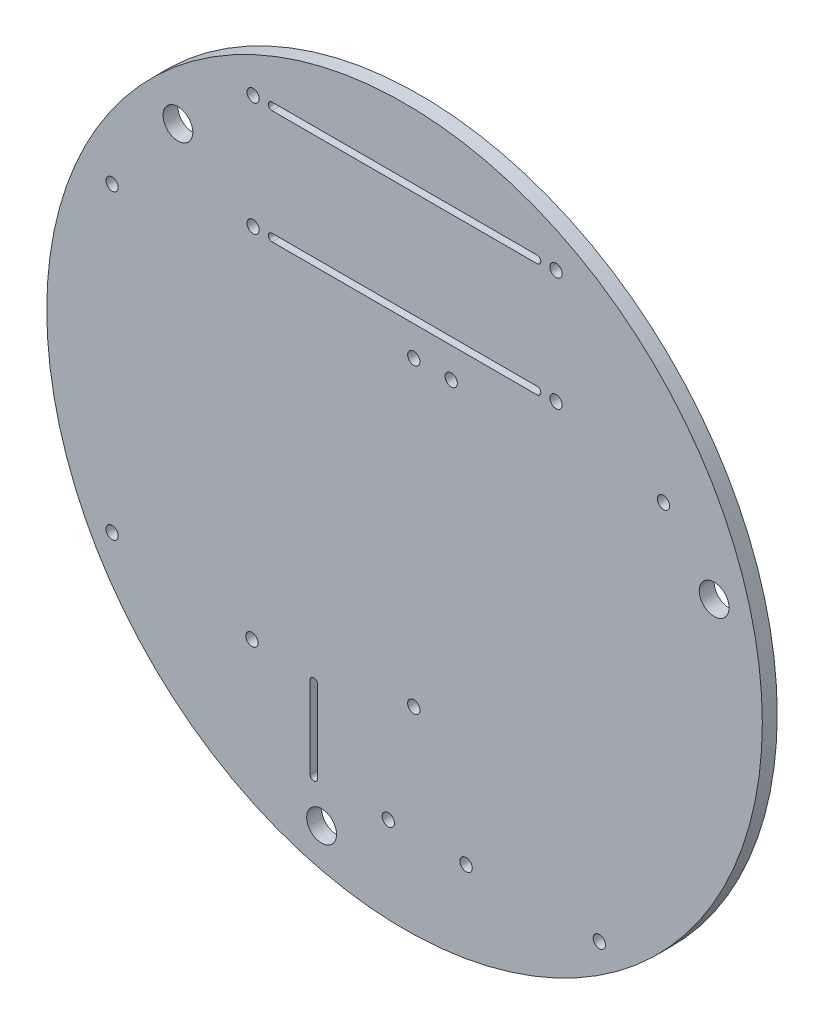
ISO-10303-21;
HEADER;
FILE_DESCRIPTION(('STEP AP214'),'2;1');
FILE_NAME('part.step','',(''),(''),'','','');
FILE_SCHEMA(('AUTOMOTIVE_DESIGN { 1 0 10303 214 1 1 1 1 }'));
ENDSEC;
DATA;
#1=APPLICATION_CONTEXT('core data for automotive mechanical design processes');
#2=APPLICATION_PROTOCOL_DEFINITION('international standard','automotive_design',2000,#1);
#3=PRODUCT_CONTEXT('',#1,'mechanical');
#4=PRODUCT('Part','Part','',(#3));
#5=PRODUCT_RELATED_PRODUCT_CATEGORY('part','',(#4));
#6=PRODUCT_DEFINITION_FORMATION('','',#4);
#7=PRODUCT_DEFINITION_CONTEXT('part definition',#1,'design');
#8=PRODUCT_DEFINITION('design','',#6,#7);
#9=PRODUCT_DEFINITION_SHAPE('','',#8);
#10=(LENGTH_UNIT() NAMED_UNIT(*) SI_UNIT(.MILLI.,.METRE.));
#11=(NAMED_UNIT(*) PLANE_ANGLE_UNIT() SI_UNIT($,.RADIAN.));
#12=(NAMED_UNIT(*) SI_UNIT($,.STERADIAN.) SOLID_ANGLE_UNIT());
#13=UNCERTAINTY_MEASURE_WITH_UNIT(LENGTH_MEASURE(1.E-05),#10,'distance_accuracy_value','');
#14=(GEOMETRIC_REPRESENTATION_CONTEXT(3) GLOBAL_UNCERTAINTY_ASSIGNED_CONTEXT((#13)) GLOBAL_UNIT_ASSIGNED_CONTEXT((#10,
#11,#12)) REPRESENTATION_CONTEXT('',''));
#15=CARTESIAN_POINT('',(0.,0.,0.));
#16=DIRECTION('',(0.,0.,1.));
#17=DIRECTION('',(1.,0.,0.));
#18=AXIS2_PLACEMENT_3D('',#15,#16,#17);
#19=CARTESIAN_POINT('',(0.,0.,2.));
#20=DIRECTION('',(0.,0.,-1.));
#21=DIRECTION('',(-1.,0.,0.));
#22=AXIS2_PLACEMENT_3D('',#19,#20,#21);
#23=CYLINDRICAL_SURFACE('',#22,48.);
#24=CARTESIAN_POINT('',(0.,0.,2.));
#25=DIRECTION('',(0.,0.,1.));
#26=DIRECTION('',(1.,0.,0.));
#27=AXIS2_PLACEMENT_3D('',#24,#25,#26);
#28=CIRCLE('',#27,48.);
#29=CARTESIAN_POINT('',(48.,0.,2.));
#30=VERTEX_POINT('',#29);
#31=EDGE_CURVE('E11',#30,#30,#28,.T.);
#32=ORIENTED_EDGE('',*,*,#31,.F.);
#33=EDGE_LOOP('',(#32));
#34=FACE_BOUND('',#33,.T.);
#35=CARTESIAN_POINT('',(0.,0.,0.));
#36=DIRECTION('',(0.,0.,1.));
#37=DIRECTION('',(1.,0.,0.));
#38=AXIS2_PLACEMENT_3D('',#35,#36,#37);
#39=CIRCLE('',#38,48.);
#40=CARTESIAN_POINT('',(48.,0.,0.));
#41=VERTEX_POINT('',#40);
#42=EDGE_CURVE('E38',#41,#41,#39,.T.);
#43=ORIENTED_EDGE('',*,*,#42,.T.);
#44=EDGE_LOOP('',(#43));
#45=FACE_BOUND('',#44,.T.);
#46=ADVANCED_FACE('F35',(#34,#45),#23,.T.);
#47=CARTESIAN_POINT('',(0.,0.,2.));
#48=DIRECTION('',(0.,0.,1.));
#49=DIRECTION('',(1.,0.,0.));
#50=AXIS2_PLACEMENT_3D('',#47,#48,#49);
#51=PLANE('',#50);
#52=CARTESIAN_POINT('',(-20.48,-24.54,2.));
#53=DIRECTION('',(0.,0.,-1.));
#54=DIRECTION('',(-1.,0.,0.));
#55=AXIS2_PLACEMENT_3D('',#52,#53,#54);
#56=CIRCLE('',#55,0.825000000000001);
#57=CARTESIAN_POINT('',(-21.305,-24.54,2.));
#58=VERTEX_POINT('',#57);
#59=EDGE_CURVE('E154',#58,#58,#56,.T.);
#60=ORIENTED_EDGE('',*,*,#59,.T.);
#61=EDGE_LOOP('',(#60));
#62=FACE_BOUND('',#61,.T.);
#63=CARTESIAN_POINT('',(-12.18,-36.34,2.));
#64=DIRECTION('',(0.,0.,-1.));
#65=DIRECTION('',(-1.,0.,0.));
#66=AXIS2_PLACEMENT_3D('',#63,#64,#65);
#67=CIRCLE('',#66,0.5);
#68=CARTESIAN_POINT('',(-11.68,-36.34,2.));
#69=VERTEX_POINT('',#68);
#70=CARTESIAN_POINT('',(-12.68,-36.34,2.));
#71=VERTEX_POINT('',#70);
#72=EDGE_CURVE('E125',#69,#71,#67,.T.);
#73=ORIENTED_EDGE('',*,*,#72,.T.);
#74=DIRECTION('',(0.,1.,0.));
#75=VECTOR('',#74,1.);
#76=CARTESIAN_POINT('',(-12.68,-36.34,2.));
#77=LINE('',#76,#75);
#78=CARTESIAN_POINT('',(-12.68,-25.34,2.));
#79=VERTEX_POINT('',#78);
#80=EDGE_CURVE('E134',#71,#79,#77,.T.);
#81=ORIENTED_EDGE('',*,*,#80,.T.);
#82=CARTESIAN_POINT('',(-12.18,-25.34,2.));
#83=DIRECTION('',(0.,0.,-1.));
#84=DIRECTION('',(-1.,0.,0.));
#85=AXIS2_PLACEMENT_3D('',#82,#83,#84);
#86=CIRCLE('',#85,0.5);
#87=CARTESIAN_POINT('',(-11.68,-25.34,2.));
#88=VERTEX_POINT('',#87);
#89=EDGE_CURVE('E49',#79,#88,#86,.T.);
#90=ORIENTED_EDGE('',*,*,#89,.T.);
#91=DIRECTION('',(0.,-1.,0.));
#92=VECTOR('',#91,1.);
#93=CARTESIAN_POINT('',(-11.68,-36.34,2.));
#94=LINE('',#93,#92);
#95=EDGE_CURVE('E131',#88,#69,#94,.T.);
#96=ORIENTED_EDGE('',*,*,#95,.T.);
#97=EDGE_LOOP('',(#73,#81,#90,#96));
#98=FACE_BOUND('',#97,.T.);
#99=CARTESIAN_POINT('',(26.13,-36.34,2.));
#100=DIRECTION('',(0.,0.,-1.));
#101=DIRECTION('',(1.,0.,0.));
#102=AXIS2_PLACEMENT_3D('',#99,#100,#101);
#103=CIRCLE('',#102,0.824999999999998);
#104=CARTESIAN_POINT('',(26.955,-36.34,2.));
#105=VERTEX_POINT('',#104);
#106=EDGE_CURVE('E459',#105,#105,#103,.T.);
#107=ORIENTED_EDGE('',*,*,#106,.T.);
#108=EDGE_LOOP('',(#107));
#109=FACE_BOUND('',#108,.T.);
#110=CARTESIAN_POINT('',(-2.18,-36.34,2.));
#111=DIRECTION('',(0.,0.,-1.));
#112=DIRECTION('',(-1.,0.,0.));
#113=AXIS2_PLACEMENT_3D('',#110,#111,#112);
#114=CIRCLE('',#113,0.825);
#115=CARTESIAN_POINT('',(-3.005,-36.34,2.));
#116=VERTEX_POINT('',#115);
#117=EDGE_CURVE('E175',#116,#116,#114,.T.);
#118=ORIENTED_EDGE('',*,*,#117,.T.);
#119=EDGE_LOOP('',(#118));
#120=FACE_BOUND('',#119,.T.);
#121=CARTESIAN_POINT('',(8.26,-36.34,2.));
#122=DIRECTION('',(0.,0.,-1.));
#123=DIRECTION('',(-1.,0.,0.));
#124=AXIS2_PLACEMENT_3D('',#121,#122,#123);
#125=CIRCLE('',#124,0.825);
#126=CARTESIAN_POINT('',(7.435,-36.34,2.));
#127=VERTEX_POINT('',#126);
#128=EDGE_CURVE('E168',#127,#127,#125,.T.);
#129=ORIENTED_EDGE('',*,*,#128,.T.);
#130=EDGE_LOOP('',(#129));
#131=FACE_BOUND('',#130,.T.);
#132=CARTESIAN_POINT('',(6.25999999999999,18.98,2.));
#133=DIRECTION('',(0.,0.,1.));
#134=DIRECTION('',(-1.,0.,0.));
#135=AXIS2_PLACEMENT_3D('',#132,#133,#134);
#136=CIRCLE('',#135,0.825000000000001);
#137=CARTESIAN_POINT('',(5.43499999999999,18.98,2.));
#138=VERTEX_POINT('',#137);
#139=EDGE_CURVE('E262',#138,#138,#136,.T.);
#140=ORIENTED_EDGE('',*,*,#139,.F.);
#141=EDGE_LOOP('',(#140));
#142=FACE_BOUND('',#141,.T.);
#143=CARTESIAN_POINT('',(-39.24,18.98,2.));
#144=DIRECTION('',(0.,0.,1.));
#145=DIRECTION('',(1.,0.,0.));
#146=AXIS2_PLACEMENT_3D('',#143,#144,#145);
#147=CIRCLE('',#146,0.825000000000001);
#148=CARTESIAN_POINT('',(-38.415,18.98,2.));
#149=VERTEX_POINT('',#148);
#150=EDGE_CURVE('E249',#149,#149,#147,.T.);
#151=ORIENTED_EDGE('',*,*,#150,.F.);
#152=EDGE_LOOP('',(#151));
#153=FACE_BOUND('',#152,.T.);
#154=CARTESIAN_POINT('',(1.24000000000001,18.98,2.));
#155=DIRECTION('',(0.,0.,1.));
#156=DIRECTION('',(-1.,0.,0.));
#157=AXIS2_PLACEMENT_3D('',#154,#155,#156);
#158=CIRCLE('',#157,0.825000000000001);
#159=CARTESIAN_POINT('',(0.415000000000004,18.98,2.));
#160=VERTEX_POINT('',#159);
#161=EDGE_CURVE('E250',#160,#160,#158,.T.);
#162=ORIENTED_EDGE('',*,*,#161,.F.);
#163=EDGE_LOOP('',(#162));
#164=FACE_BOUND('',#163,.T.);
#165=CARTESIAN_POINT('',(1.24000000000001,-21.5,2.));
#166=DIRECTION('',(0.,0.,1.));
#167=DIRECTION('',(1.,0.,0.));
#168=AXIS2_PLACEMENT_3D('',#165,#166,#167);
#169=CIRCLE('',#168,0.825000000000001);
#170=CARTESIAN_POINT('',(2.06500000000001,-21.5,2.));
#171=VERTEX_POINT('',#170);
#172=EDGE_CURVE('E179',#171,#171,#169,.T.);
#173=ORIENTED_EDGE('',*,*,#172,.F.);
#174=EDGE_LOOP('',(#173));
#175=FACE_BOUND('',#174,.T.);
#176=CARTESIAN_POINT('',(20.32,23.5,2.));
#177=DIRECTION('',(0.,0.,1.));
#178=DIRECTION('',(-1.,0.,0.));
#179=AXIS2_PLACEMENT_3D('',#176,#177,#178);
#180=CIRCLE('',#179,0.825000000000001);
#181=CARTESIAN_POINT('',(19.495,23.5,2.));
#182=VERTEX_POINT('',#181);
#183=EDGE_CURVE('E286',#182,#182,#180,.T.);
#184=ORIENTED_EDGE('',*,*,#183,.F.);
#185=EDGE_LOOP('',(#184));
#186=FACE_BOUND('',#185,.T.);
#187=CARTESIAN_POINT('',(-20.32,23.5,2.));
#188=DIRECTION('',(0.,0.,1.));
#189=DIRECTION('',(1.,0.,0.));
#190=AXIS2_PLACEMENT_3D('',#187,#188,#189);
#191=CIRCLE('',#190,0.825000000000001);
#192=CARTESIAN_POINT('',(-19.495,23.5,2.));
#193=VERTEX_POINT('',#192);
#194=EDGE_CURVE('E273',#193,#193,#191,.T.);
#195=ORIENTED_EDGE('',*,*,#194,.F.);
#196=EDGE_LOOP('',(#195));
#197=FACE_BOUND('',#196,.T.);
#198=CARTESIAN_POINT('',(-20.32,38.74,2.));
#199=DIRECTION('',(0.,0.,1.));
#200=DIRECTION('',(-1.,0.,0.));
#201=AXIS2_PLACEMENT_3D('',#198,#199,#200);
#202=CIRCLE('',#201,0.825000000000001);
#203=CARTESIAN_POINT('',(-21.145,38.74,2.));
#204=VERTEX_POINT('',#203);
#205=EDGE_CURVE('E274',#204,#204,#202,.T.);
#206=ORIENTED_EDGE('',*,*,#205,.F.);
#207=EDGE_LOOP('',(#206));
#208=FACE_BOUND('',#207,.T.);
#209=CARTESIAN_POINT('',(34.74,18.98,2.));
#210=DIRECTION('',(0.,0.,1.));
#211=DIRECTION('',(1.,0.,0.));
#212=AXIS2_PLACEMENT_3D('',#209,#210,#211);
#213=CIRCLE('',#212,0.825000000000001);
#214=CARTESIAN_POINT('',(35.565,18.98,2.));
#215=VERTEX_POINT('',#214);
#216=EDGE_CURVE('E261',#215,#215,#213,.T.);
#217=ORIENTED_EDGE('',*,*,#216,.F.);
#218=EDGE_LOOP('',(#217));
#219=FACE_BOUND('',#218,.T.);
#220=CARTESIAN_POINT('',(-39.24,-21.5,2.));
#221=DIRECTION('',(0.,0.,1.));
#222=DIRECTION('',(-1.,0.,0.));
#223=AXIS2_PLACEMENT_3D('',#220,#221,#222);
#224=CIRCLE('',#223,0.825000000000001);
#225=CARTESIAN_POINT('',(-40.065,-21.5,2.));
#226=VERTEX_POINT('',#225);
#227=EDGE_CURVE('E180',#226,#226,#224,.T.);
#228=ORIENTED_EDGE('',*,*,#227,.F.);
#229=EDGE_LOOP('',(#228));
#230=FACE_BOUND('',#229,.T.);
#231=CARTESIAN_POINT('',(17.78,23.5,2.));
#232=DIRECTION('',(0.,0.,1.));
#233=DIRECTION('',(1.,0.,0.));
#234=AXIS2_PLACEMENT_3D('',#231,#232,#233);
#235=CIRCLE('',#234,0.499999999999997);
#236=CARTESIAN_POINT('',(17.78,23.,2.));
#237=VERTEX_POINT('',#236);
#238=CARTESIAN_POINT('',(17.78,24.,2.));
#239=VERTEX_POINT('',#238);
#240=EDGE_CURVE('E198',#237,#239,#235,.T.);
#241=ORIENTED_EDGE('',*,*,#240,.F.);
#242=DIRECTION('',(1.,0.,0.));
#243=VECTOR('',#242,1.);
#244=CARTESIAN_POINT('',(17.78,23.,2.));
#245=LINE('',#244,#243);
#246=CARTESIAN_POINT('',(-17.78,23.,2.));
#247=VERTEX_POINT('',#246);
#248=EDGE_CURVE('E188',#247,#237,#245,.T.);
#249=ORIENTED_EDGE('',*,*,#248,.F.);
#250=CARTESIAN_POINT('',(-17.78,23.5,2.));
#251=DIRECTION('',(0.,0.,1.));
#252=DIRECTION('',(1.,0.,0.));
#253=AXIS2_PLACEMENT_3D('',#250,#251,#252);
#254=CIRCLE('',#253,0.500000000000002);
#255=CARTESIAN_POINT('',(-17.78,24.,2.));
#256=VERTEX_POINT('',#255);
#257=EDGE_CURVE('E204',#256,#247,#254,.T.);
#258=ORIENTED_EDGE('',*,*,#257,.F.);
#259=DIRECTION('',(-1.,0.,0.));
#260=VECTOR('',#259,1.);
#261=CARTESIAN_POINT('',(17.78,24.,2.));
#262=LINE('',#261,#260);
#263=EDGE_CURVE('E200',#239,#256,#262,.T.);
#264=ORIENTED_EDGE('',*,*,#263,.F.);
#265=EDGE_LOOP('',(#241,#249,#258,#264));
#266=FACE_BOUND('',#265,.T.);
#267=CARTESIAN_POINT('',(17.78,38.74,2.));
#268=DIRECTION('',(0.,0.,1.));
#269=DIRECTION('',(-1.,0.,0.));
#270=AXIS2_PLACEMENT_3D('',#267,#268,#269);
#271=CIRCLE('',#270,0.5);
#272=CARTESIAN_POINT('',(17.78,38.24,2.));
#273=VERTEX_POINT('',#272);
#274=CARTESIAN_POINT('',(17.78,39.24,2.));
#275=VERTEX_POINT('',#274);
#276=EDGE_CURVE('E171',#273,#275,#271,.T.);
#277=ORIENTED_EDGE('',*,*,#276,.F.);
#278=DIRECTION('',(1.,0.,0.));
#279=VECTOR('',#278,1.);
#280=CARTESIAN_POINT('',(17.78,38.24,2.));
#281=LINE('',#280,#279);
#282=CARTESIAN_POINT('',(-17.78,38.24,2.));
#283=VERTEX_POINT('',#282);
#284=EDGE_CURVE('E220',#283,#273,#281,.T.);
#285=ORIENTED_EDGE('',*,*,#284,.F.);
#286=CARTESIAN_POINT('',(-17.78,38.74,2.));
#287=DIRECTION('',(0.,0.,1.));
#288=DIRECTION('',(-1.,0.,0.));
#289=AXIS2_PLACEMENT_3D('',#286,#287,#288);
#290=CIRCLE('',#289,0.5);
#291=CARTESIAN_POINT('',(-17.78,39.24,2.));
#292=VERTEX_POINT('',#291);
#293=EDGE_CURVE('E234',#292,#283,#290,.T.);
#294=ORIENTED_EDGE('',*,*,#293,.F.);
#295=DIRECTION('',(-1.,0.,0.));
#296=VECTOR('',#295,1.);
#297=CARTESIAN_POINT('',(17.78,39.24,2.));
#298=LINE('',#297,#296);
#299=EDGE_CURVE('E231',#275,#292,#298,.T.);
#300=ORIENTED_EDGE('',*,*,#299,.F.);
#301=EDGE_LOOP('',(#277,#285,#294,#300));
#302=FACE_BOUND('',#301,.T.);
#303=CARTESIAN_POINT('',(20.32,38.74,2.));
#304=DIRECTION('',(0.,0.,1.));
#305=DIRECTION('',(1.,0.,0.));
#306=AXIS2_PLACEMENT_3D('',#303,#304,#305);
#307=CIRCLE('',#306,0.825000000000001);
#308=CARTESIAN_POINT('',(21.145,38.74,2.));
#309=VERTEX_POINT('',#308);
#310=EDGE_CURVE('E285',#309,#309,#307,.T.);
#311=ORIENTED_EDGE('',*,*,#310,.F.);
#312=EDGE_LOOP('',(#311));
#313=FACE_BOUND('',#312,.T.);
#314=CARTESIAN_POINT('',(41.5348105304283,11.1292189394104,2.));
#315=DIRECTION('',(0.,0.,-1.));
#316=DIRECTION('',(-1.,0.,0.));
#317=AXIS2_PLACEMENT_3D('',#314,#315,#316);
#318=CIRCLE('',#317,2.);
#319=CARTESIAN_POINT('',(39.5348105304283,11.1292189394104,2.));
#320=VERTEX_POINT('',#319);
#321=EDGE_CURVE('E300',#320,#320,#318,.T.);
#322=ORIENTED_EDGE('',*,*,#321,.T.);
#323=EDGE_LOOP('',(#322));
#324=FACE_BOUND('',#323,.T.);
#325=CARTESIAN_POINT('',(-30.4055915910216,30.4055915910215,2.));
#326=DIRECTION('',(0.,0.,-1.));
#327=DIRECTION('',(-1.,0.,0.));
#328=AXIS2_PLACEMENT_3D('',#325,#326,#327);
#329=CIRCLE('',#328,2.00000000000001);
#330=CARTESIAN_POINT('',(-32.4055915910216,30.4055915910215,2.));
#331=VERTEX_POINT('',#330);
#332=EDGE_CURVE('E309',#331,#331,#329,.T.);
#333=ORIENTED_EDGE('',*,*,#332,.T.);
#334=EDGE_LOOP('',(#333));
#335=FACE_BOUND('',#334,.T.);
#336=CARTESIAN_POINT('',(-11.1292189394084,-41.534810530431,2.));
#337=DIRECTION('',(0.,0.,-1.));
#338=DIRECTION('',(-1.,0.,0.));
#339=AXIS2_PLACEMENT_3D('',#336,#337,#338);
#340=CIRCLE('',#339,2.);
#341=CARTESIAN_POINT('',(-13.1292189394084,-41.534810530431,2.));
#342=VERTEX_POINT('',#341);
#343=EDGE_CURVE('E297',#342,#342,#340,.T.);
#344=ORIENTED_EDGE('',*,*,#343,.T.);
#345=EDGE_LOOP('',(#344));
#346=FACE_BOUND('',#345,.T.);
#347=ORIENTED_EDGE('',*,*,#31,.T.);
#348=EDGE_LOOP('',(#347));
#349=FACE_BOUND('',#348,.T.);
#350=ADVANCED_FACE('F138',(#62,#98,#109,#120,#131,#142,#153,#164,#175,#186,#197,#208,#219,#230,
#266,#302,#313,#324,#335,#346,#349),#51,.T.);
#351=CARTESIAN_POINT('',(0.,0.,0.));
#352=DIRECTION('',(0.,0.,1.));
#353=DIRECTION('',(1.,0.,0.));
#354=AXIS2_PLACEMENT_3D('',#351,#352,#353);
#355=PLANE('',#354);
#356=CARTESIAN_POINT('',(-20.48,-24.54,0.));
#357=DIRECTION('',(0.,0.,-1.));
#358=DIRECTION('',(-1.,0.,0.));
#359=AXIS2_PLACEMENT_3D('',#356,#357,#358);
#360=CIRCLE('',#359,0.825000000000001);
#361=CARTESIAN_POINT('',(-21.305,-24.54,0.));
#362=VERTEX_POINT('',#361);
#363=EDGE_CURVE('E165',#362,#362,#360,.T.);
#364=ORIENTED_EDGE('',*,*,#363,.F.);
#365=EDGE_LOOP('',(#364));
#366=FACE_BOUND('',#365,.T.);
#367=DIRECTION('',(0.,1.,0.));
#368=VECTOR('',#367,1.);
#369=CARTESIAN_POINT('',(-12.68,-36.34,0.));
#370=LINE('',#369,#368);
#371=CARTESIAN_POINT('',(-12.68,-36.34,0.));
#372=VERTEX_POINT('',#371);
#373=CARTESIAN_POINT('',(-12.68,-25.34,0.));
#374=VERTEX_POINT('',#373);
#375=EDGE_CURVE('E153',#372,#374,#370,.T.);
#376=ORIENTED_EDGE('',*,*,#375,.F.);
#377=CARTESIAN_POINT('',(-12.18,-36.34,0.));
#378=DIRECTION('',(0.,0.,-1.));
#379=DIRECTION('',(-1.,0.,0.));
#380=AXIS2_PLACEMENT_3D('',#377,#378,#379);
#381=CIRCLE('',#380,0.5);
#382=CARTESIAN_POINT('',(-11.68,-36.34,0.));
#383=VERTEX_POINT('',#382);
#384=EDGE_CURVE('E57',#383,#372,#381,.T.);
#385=ORIENTED_EDGE('',*,*,#384,.F.);
#386=DIRECTION('',(0.,-1.,0.));
#387=VECTOR('',#386,1.);
#388=CARTESIAN_POINT('',(-11.68,-36.34,0.));
#389=LINE('',#388,#387);
#390=CARTESIAN_POINT('',(-11.68,-25.34,0.));
#391=VERTEX_POINT('',#390);
#392=EDGE_CURVE('E141',#391,#383,#389,.T.);
#393=ORIENTED_EDGE('',*,*,#392,.F.);
#394=CARTESIAN_POINT('',(-12.18,-25.34,0.));
#395=DIRECTION('',(0.,0.,-1.));
#396=DIRECTION('',(-1.,0.,0.));
#397=AXIS2_PLACEMENT_3D('',#394,#395,#396);
#398=CIRCLE('',#397,0.5);
#399=EDGE_CURVE('E144',#374,#391,#398,.T.);
#400=ORIENTED_EDGE('',*,*,#399,.F.);
#401=EDGE_LOOP('',(#376,#385,#393,#400));
#402=FACE_BOUND('',#401,.T.);
#403=CARTESIAN_POINT('',(26.13,-36.34,0.));
#404=DIRECTION('',(0.,0.,-1.));
#405=DIRECTION('',(1.,0.,0.));
#406=AXIS2_PLACEMENT_3D('',#403,#404,#405);
#407=CIRCLE('',#406,0.824999999999998);
#408=CARTESIAN_POINT('',(26.955,-36.34,0.));
#409=VERTEX_POINT('',#408);
#410=EDGE_CURVE('E147',#409,#409,#407,.T.);
#411=ORIENTED_EDGE('',*,*,#410,.F.);
#412=EDGE_LOOP('',(#411));
#413=FACE_BOUND('',#412,.T.);
#414=CARTESIAN_POINT('',(-2.18,-36.34,0.));
#415=DIRECTION('',(0.,0.,-1.));
#416=DIRECTION('',(-1.,0.,0.));
#417=AXIS2_PLACEMENT_3D('',#414,#415,#416);
#418=CIRCLE('',#417,0.825);
#419=CARTESIAN_POINT('',(-3.005,-36.34,0.));
#420=VERTEX_POINT('',#419);
#421=EDGE_CURVE('E457',#420,#420,#418,.T.);
#422=ORIENTED_EDGE('',*,*,#421,.F.);
#423=EDGE_LOOP('',(#422));
#424=FACE_BOUND('',#423,.T.);
#425=CARTESIAN_POINT('',(8.26,-36.34,0.));
#426=DIRECTION('',(0.,0.,-1.));
#427=DIRECTION('',(-1.,0.,0.));
#428=AXIS2_PLACEMENT_3D('',#425,#426,#427);
#429=CIRCLE('',#428,0.825);
#430=CARTESIAN_POINT('',(7.435,-36.34,0.));
#431=VERTEX_POINT('',#430);
#432=EDGE_CURVE('E172',#431,#431,#429,.T.);
#433=ORIENTED_EDGE('',*,*,#432,.F.);
#434=EDGE_LOOP('',(#433));
#435=FACE_BOUND('',#434,.T.);
#436=CARTESIAN_POINT('',(6.25999999999999,18.98,0.));
#437=DIRECTION('',(0.,0.,1.));
#438=DIRECTION('',(-1.,0.,0.));
#439=AXIS2_PLACEMENT_3D('',#436,#437,#438);
#440=CIRCLE('',#439,0.825000000000001);
#441=CARTESIAN_POINT('',(5.43499999999999,18.98,0.));
#442=VERTEX_POINT('',#441);
#443=EDGE_CURVE('E258',#442,#442,#440,.T.);
#444=ORIENTED_EDGE('',*,*,#443,.T.);
#445=EDGE_LOOP('',(#444));
#446=FACE_BOUND('',#445,.T.);
#447=CARTESIAN_POINT('',(-39.24,18.98,0.));
#448=DIRECTION('',(0.,0.,1.));
#449=DIRECTION('',(1.,0.,0.));
#450=AXIS2_PLACEMENT_3D('',#447,#448,#449);
#451=CIRCLE('',#450,0.825000000000001);
#452=CARTESIAN_POINT('',(-38.415,18.98,0.));
#453=VERTEX_POINT('',#452);
#454=EDGE_CURVE('E265',#453,#453,#451,.T.);
#455=ORIENTED_EDGE('',*,*,#454,.T.);
#456=EDGE_LOOP('',(#455));
#457=FACE_BOUND('',#456,.T.);
#458=CARTESIAN_POINT('',(1.24000000000001,18.98,0.));
#459=DIRECTION('',(0.,0.,1.));
#460=DIRECTION('',(-1.,0.,0.));
#461=AXIS2_PLACEMENT_3D('',#458,#459,#460);
#462=CIRCLE('',#461,0.825000000000001);
#463=CARTESIAN_POINT('',(0.415000000000004,18.98,0.));
#464=VERTEX_POINT('',#463);
#465=EDGE_CURVE('E246',#464,#464,#462,.T.);
#466=ORIENTED_EDGE('',*,*,#465,.T.);
#467=EDGE_LOOP('',(#466));
#468=FACE_BOUND('',#467,.T.);
#469=CARTESIAN_POINT('',(1.24000000000001,-21.5,0.));
#470=DIRECTION('',(0.,0.,1.));
#471=DIRECTION('',(1.,0.,0.));
#472=AXIS2_PLACEMENT_3D('',#469,#470,#471);
#473=CIRCLE('',#472,0.825000000000001);
#474=CARTESIAN_POINT('',(2.06500000000001,-21.5,0.));
#475=VERTEX_POINT('',#474);
#476=EDGE_CURVE('E253',#475,#475,#473,.T.);
#477=ORIENTED_EDGE('',*,*,#476,.T.);
#478=EDGE_LOOP('',(#477));
#479=FACE_BOUND('',#478,.T.);
#480=CARTESIAN_POINT('',(20.32,23.5,0.));
#481=DIRECTION('',(0.,0.,1.));
#482=DIRECTION('',(-1.,0.,0.));
#483=AXIS2_PLACEMENT_3D('',#480,#481,#482);
#484=CIRCLE('',#483,0.825000000000001);
#485=CARTESIAN_POINT('',(19.495,23.5,0.));
#486=VERTEX_POINT('',#485);
#487=EDGE_CURVE('E282',#486,#486,#484,.T.);
#488=ORIENTED_EDGE('',*,*,#487,.T.);
#489=EDGE_LOOP('',(#488));
#490=FACE_BOUND('',#489,.T.);
#491=CARTESIAN_POINT('',(-20.32,23.5,0.));
#492=DIRECTION('',(0.,0.,1.));
#493=DIRECTION('',(1.,0.,0.));
#494=AXIS2_PLACEMENT_3D('',#491,#492,#493);
#495=CIRCLE('',#494,0.825000000000001);
#496=CARTESIAN_POINT('',(-19.495,23.5,0.));
#497=VERTEX_POINT('',#496);
#498=EDGE_CURVE('E289',#497,#497,#495,.T.);
#499=ORIENTED_EDGE('',*,*,#498,.T.);
#500=EDGE_LOOP('',(#499));
#501=FACE_BOUND('',#500,.T.);
#502=CARTESIAN_POINT('',(-20.32,38.74,0.));
#503=DIRECTION('',(0.,0.,1.));
#504=DIRECTION('',(-1.,0.,0.));
#505=AXIS2_PLACEMENT_3D('',#502,#503,#504);
#506=CIRCLE('',#505,0.825000000000001);
#507=CARTESIAN_POINT('',(-21.145,38.74,0.));
#508=VERTEX_POINT('',#507);
#509=EDGE_CURVE('E270',#508,#508,#506,.T.);
#510=ORIENTED_EDGE('',*,*,#509,.T.);
#511=EDGE_LOOP('',(#510));
#512=FACE_BOUND('',#511,.T.);
#513=CARTESIAN_POINT('',(34.74,18.98,0.));
#514=DIRECTION('',(0.,0.,1.));
#515=DIRECTION('',(1.,0.,0.));
#516=AXIS2_PLACEMENT_3D('',#513,#514,#515);
#517=CIRCLE('',#516,0.825000000000001);
#518=CARTESIAN_POINT('',(35.565,18.98,0.));
#519=VERTEX_POINT('',#518);
#520=EDGE_CURVE('E277',#519,#519,#517,.T.);
#521=ORIENTED_EDGE('',*,*,#520,.T.);
#522=EDGE_LOOP('',(#521));
#523=FACE_BOUND('',#522,.T.);
#524=CARTESIAN_POINT('',(-39.24,-21.5,0.));
#525=DIRECTION('',(0.,0.,1.));
#526=DIRECTION('',(-1.,0.,0.));
#527=AXIS2_PLACEMENT_3D('',#524,#525,#526);
#528=CIRCLE('',#527,0.825000000000001);
#529=CARTESIAN_POINT('',(-40.065,-21.5,0.));
#530=VERTEX_POINT('',#529);
#531=EDGE_CURVE('E176',#530,#530,#528,.T.);
#532=ORIENTED_EDGE('',*,*,#531,.T.);
#533=EDGE_LOOP('',(#532));
#534=FACE_BOUND('',#533,.T.);
#535=DIRECTION('',(1.,0.,0.));
#536=VECTOR('',#535,1.);
#537=CARTESIAN_POINT('',(17.78,23.,0.));
#538=LINE('',#537,#536);
#539=CARTESIAN_POINT('',(-17.78,23.,0.));
#540=VERTEX_POINT('',#539);
#541=CARTESIAN_POINT('',(17.78,23.,0.));
#542=VERTEX_POINT('',#541);
#543=EDGE_CURVE('E194',#540,#542,#538,.T.);
#544=ORIENTED_EDGE('',*,*,#543,.T.);
#545=CARTESIAN_POINT('',(17.78,23.5,0.));
#546=DIRECTION('',(0.,0.,1.));
#547=DIRECTION('',(1.,0.,0.));
#548=AXIS2_PLACEMENT_3D('',#545,#546,#547);
#549=CIRCLE('',#548,0.499999999999997);
#550=CARTESIAN_POINT('',(17.78,24.,0.));
#551=VERTEX_POINT('',#550);
#552=EDGE_CURVE('E184',#542,#551,#549,.T.);
#553=ORIENTED_EDGE('',*,*,#552,.T.);
#554=DIRECTION('',(-1.,0.,0.));
#555=VECTOR('',#554,1.);
#556=CARTESIAN_POINT('',(17.78,24.,0.));
#557=LINE('',#556,#555);
#558=CARTESIAN_POINT('',(-17.78,24.,0.));
#559=VERTEX_POINT('',#558);
#560=EDGE_CURVE('E187',#551,#559,#557,.T.);
#561=ORIENTED_EDGE('',*,*,#560,.T.);
#562=CARTESIAN_POINT('',(-17.78,23.5,0.));
#563=DIRECTION('',(0.,0.,1.));
#564=DIRECTION('',(1.,0.,0.));
#565=AXIS2_PLACEMENT_3D('',#562,#563,#564);
#566=CIRCLE('',#565,0.500000000000002);
#567=EDGE_CURVE('E191',#559,#540,#566,.T.);
#568=ORIENTED_EDGE('',*,*,#567,.T.);
#569=EDGE_LOOP('',(#544,#553,#561,#568));
#570=FACE_BOUND('',#569,.T.);
#571=DIRECTION('',(1.,0.,0.));
#572=VECTOR('',#571,1.);
#573=CARTESIAN_POINT('',(17.78,38.24,0.));
#574=LINE('',#573,#572);
#575=CARTESIAN_POINT('',(-17.78,38.24,0.));
#576=VERTEX_POINT('',#575);
#577=CARTESIAN_POINT('',(17.78,38.24,0.));
#578=VERTEX_POINT('',#577);
#579=EDGE_CURVE('E226',#576,#578,#574,.T.);
#580=ORIENTED_EDGE('',*,*,#579,.T.);
#581=CARTESIAN_POINT('',(17.78,38.74,0.));
#582=DIRECTION('',(0.,0.,1.));
#583=DIRECTION('',(-1.,0.,0.));
#584=AXIS2_PLACEMENT_3D('',#581,#582,#583);
#585=CIRCLE('',#584,0.5);
#586=CARTESIAN_POINT('',(17.78,39.24,0.));
#587=VERTEX_POINT('',#586);
#588=EDGE_CURVE('E216',#578,#587,#585,.T.);
#589=ORIENTED_EDGE('',*,*,#588,.T.);
#590=DIRECTION('',(-1.,0.,0.));
#591=VECTOR('',#590,1.);
#592=CARTESIAN_POINT('',(17.78,39.24,0.));
#593=LINE('',#592,#591);
#594=CARTESIAN_POINT('',(-17.78,39.24,0.));
#595=VERTEX_POINT('',#594);
#596=EDGE_CURVE('E219',#587,#595,#593,.T.);
#597=ORIENTED_EDGE('',*,*,#596,.T.);
#598=CARTESIAN_POINT('',(-17.78,38.74,0.));
#599=DIRECTION('',(0.,0.,1.));
#600=DIRECTION('',(-1.,0.,0.));
#601=AXIS2_PLACEMENT_3D('',#598,#599,#600);
#602=CIRCLE('',#601,0.5);
#603=EDGE_CURVE('E223',#595,#576,#602,.T.);
#604=ORIENTED_EDGE('',*,*,#603,.T.);
#605=EDGE_LOOP('',(#580,#589,#597,#604));
#606=FACE_BOUND('',#605,.T.);
#607=CARTESIAN_POINT('',(20.32,38.74,0.));
#608=DIRECTION('',(0.,0.,1.));
#609=DIRECTION('',(1.,0.,0.));
#610=AXIS2_PLACEMENT_3D('',#607,#608,#609);
#611=CIRCLE('',#610,0.825000000000001);
#612=CARTESIAN_POINT('',(21.145,38.74,0.));
#613=VERTEX_POINT('',#612);
#614=EDGE_CURVE('E294',#613,#613,#611,.T.);
#615=ORIENTED_EDGE('',*,*,#614,.T.);
#616=EDGE_LOOP('',(#615));
#617=FACE_BOUND('',#616,.T.);
#618=CARTESIAN_POINT('',(41.5348105304283,11.1292189394104,0.));
#619=DIRECTION('',(0.,0.,-1.));
#620=DIRECTION('',(-1.,0.,0.));
#621=AXIS2_PLACEMENT_3D('',#618,#619,#620);
#622=CIRCLE('',#621,2.);
#623=CARTESIAN_POINT('',(39.5348105304283,11.1292189394104,0.));
#624=VERTEX_POINT('',#623);
#625=EDGE_CURVE('E303',#624,#624,#622,.T.);
#626=ORIENTED_EDGE('',*,*,#625,.F.);
#627=EDGE_LOOP('',(#626));
#628=FACE_BOUND('',#627,.T.);
#629=CARTESIAN_POINT('',(-30.4055915910216,30.4055915910215,0.));
#630=DIRECTION('',(0.,0.,-1.));
#631=DIRECTION('',(-1.,0.,0.));
#632=AXIS2_PLACEMENT_3D('',#629,#630,#631);
#633=CIRCLE('',#632,2.00000000000001);
#634=CARTESIAN_POINT('',(-32.4055915910216,30.4055915910215,0.));
#635=VERTEX_POINT('',#634);
#636=EDGE_CURVE('E306',#635,#635,#633,.T.);
#637=ORIENTED_EDGE('',*,*,#636,.F.);
#638=EDGE_LOOP('',(#637));
#639=FACE_BOUND('',#638,.T.);
#640=CARTESIAN_POINT('',(-11.1292189394084,-41.534810530431,0.));
#641=DIRECTION('',(0.,0.,-1.));
#642=DIRECTION('',(-1.,0.,0.));
#643=AXIS2_PLACEMENT_3D('',#640,#641,#642);
#644=CIRCLE('',#643,2.);
#645=CARTESIAN_POINT('',(-13.1292189394084,-41.534810530431,0.));
#646=VERTEX_POINT('',#645);
#647=EDGE_CURVE('E312',#646,#646,#644,.T.);
#648=ORIENTED_EDGE('',*,*,#647,.F.);
#649=EDGE_LOOP('',(#648));
#650=FACE_BOUND('',#649,.T.);
#651=ORIENTED_EDGE('',*,*,#42,.F.);
#652=EDGE_LOOP('',(#651));
#653=FACE_BOUND('',#652,.T.);
#654=ADVANCED_FACE('F324',(#366,#402,#413,#424,#435,#446,#457,#468,#479,#490,#501,#512,#523,
#534,#570,#606,#617,#628,#639,#650,#653),#355,.F.);
#655=CARTESIAN_POINT('',(-11.1292189394084,-41.534810530431,2.));
#656=DIRECTION('',(0.,0.,-1.));
#657=DIRECTION('',(-1.,0.,0.));
#658=AXIS2_PLACEMENT_3D('',#655,#656,#657);
#659=CYLINDRICAL_SURFACE('',#658,2.);
#660=ORIENTED_EDGE('',*,*,#343,.F.);
#661=EDGE_LOOP('',(#660));
#662=FACE_BOUND('',#661,.T.);
#663=ORIENTED_EDGE('',*,*,#647,.T.);
#664=EDGE_LOOP('',(#663));
#665=FACE_BOUND('',#664,.T.);
#666=ADVANCED_FACE('F320',(#662,#665),#659,.F.);
#667=CARTESIAN_POINT('',(-30.4055915910216,30.4055915910215,2.));
#668=DIRECTION('',(0.,0.,-1.));
#669=DIRECTION('',(-1.,0.,0.));
#670=AXIS2_PLACEMENT_3D('',#667,#668,#669);
#671=CYLINDRICAL_SURFACE('',#670,2.00000000000001);
#672=ORIENTED_EDGE('',*,*,#332,.F.);
#673=EDGE_LOOP('',(#672));
#674=FACE_BOUND('',#673,.T.);
#675=ORIENTED_EDGE('',*,*,#636,.T.);
#676=EDGE_LOOP('',(#675));
#677=FACE_BOUND('',#676,.T.);
#678=ADVANCED_FACE('F323',(#674,#677),#671,.F.);
#679=CARTESIAN_POINT('',(41.5348105304283,11.1292189394104,2.));
#680=DIRECTION('',(0.,0.,-1.));
#681=DIRECTION('',(-1.,0.,0.));
#682=AXIS2_PLACEMENT_3D('',#679,#680,#681);
#683=CYLINDRICAL_SURFACE('',#682,2.);
#684=ORIENTED_EDGE('',*,*,#321,.F.);
#685=EDGE_LOOP('',(#684));
#686=FACE_BOUND('',#685,.T.);
#687=ORIENTED_EDGE('',*,*,#625,.T.);
#688=EDGE_LOOP('',(#687));
#689=FACE_BOUND('',#688,.T.);
#690=ADVANCED_FACE('F347',(#686,#689),#683,.F.);
#691=CARTESIAN_POINT('',(20.32,38.74,0.));
#692=DIRECTION('',(0.,0.,1.));
#693=DIRECTION('',(1.,0.,0.));
#694=AXIS2_PLACEMENT_3D('',#691,#692,#693);
#695=CYLINDRICAL_SURFACE('',#694,0.825000000000001);
#696=ORIENTED_EDGE('',*,*,#614,.F.);
#697=EDGE_LOOP('',(#696));
#698=FACE_BOUND('',#697,.T.);
#699=ORIENTED_EDGE('',*,*,#310,.T.);
#700=EDGE_LOOP('',(#699));
#701=FACE_BOUND('',#700,.T.);
#702=ADVANCED_FACE('F351',(#698,#701),#695,.F.);
#703=CARTESIAN_POINT('',(17.78,38.74,0.));
#704=DIRECTION('',(0.,0.,1.));
#705=DIRECTION('',(1.,0.,0.));
#706=AXIS2_PLACEMENT_3D('',#703,#704,#705);
#707=CYLINDRICAL_SURFACE('',#706,0.5);
#708=ORIENTED_EDGE('',*,*,#276,.T.);
#709=DIRECTION('',(0.,0.,1.));
#710=VECTOR('',#709,1.);
#711=CARTESIAN_POINT('',(17.78,39.24,0.));
#712=LINE('',#711,#710);
#713=EDGE_CURVE('E229',#587,#275,#712,.T.);
#714=ORIENTED_EDGE('',*,*,#713,.F.);
#715=ORIENTED_EDGE('',*,*,#588,.F.);
#716=DIRECTION('',(0.,0.,1.));
#717=VECTOR('',#716,1.);
#718=CARTESIAN_POINT('',(17.78,38.24,0.));
#719=LINE('',#718,#717);
#720=EDGE_CURVE('E201',#578,#273,#719,.T.);
#721=ORIENTED_EDGE('',*,*,#720,.T.);
#722=EDGE_LOOP('',(#708,#714,#715,#721));
#723=FACE_BOUND('',#722,.T.);
#724=ADVANCED_FACE('F355',(#723),#707,.F.);
#725=CARTESIAN_POINT('',(17.78,38.24,0.));
#726=DIRECTION('',(0.,-1.,0.));
#727=DIRECTION('',(0.,0.,-1.));
#728=AXIS2_PLACEMENT_3D('',#725,#726,#727);
#729=PLANE('',#728);
#730=ORIENTED_EDGE('',*,*,#284,.T.);
#731=ORIENTED_EDGE('',*,*,#720,.F.);
#732=ORIENTED_EDGE('',*,*,#579,.F.);
#733=DIRECTION('',(0.,0.,1.));
#734=VECTOR('',#733,1.);
#735=CARTESIAN_POINT('',(-17.78,38.24,0.));
#736=LINE('',#735,#734);
#737=EDGE_CURVE('E240',#576,#283,#736,.T.);
#738=ORIENTED_EDGE('',*,*,#737,.T.);
#739=EDGE_LOOP('',(#730,#731,#732,#738));
#740=FACE_BOUND('',#739,.T.);
#741=ADVANCED_FACE('F393',(#740),#729,.F.);
#742=CARTESIAN_POINT('',(-17.78,38.74,0.));
#743=DIRECTION('',(0.,0.,1.));
#744=DIRECTION('',(1.,0.,0.));
#745=AXIS2_PLACEMENT_3D('',#742,#743,#744);
#746=CYLINDRICAL_SURFACE('',#745,0.5);
#747=ORIENTED_EDGE('',*,*,#293,.T.);
#748=ORIENTED_EDGE('',*,*,#737,.F.);
#749=ORIENTED_EDGE('',*,*,#603,.F.);
#750=DIRECTION('',(0.,0.,1.));
#751=VECTOR('',#750,1.);
#752=CARTESIAN_POINT('',(-17.78,39.24,0.));
#753=LINE('',#752,#751);
#754=EDGE_CURVE('E242',#595,#292,#753,.T.);
#755=ORIENTED_EDGE('',*,*,#754,.T.);
#756=EDGE_LOOP('',(#747,#748,#749,#755));
#757=FACE_BOUND('',#756,.T.);
#758=ADVANCED_FACE('F399',(#757),#746,.F.);
#759=CARTESIAN_POINT('',(17.78,39.24,0.));
#760=DIRECTION('',(0.,1.,0.));
#761=DIRECTION('',(0.,0.,1.));
#762=AXIS2_PLACEMENT_3D('',#759,#760,#761);
#763=PLANE('',#762);
#764=ORIENTED_EDGE('',*,*,#299,.T.);
#765=ORIENTED_EDGE('',*,*,#754,.F.);
#766=ORIENTED_EDGE('',*,*,#596,.F.);
#767=ORIENTED_EDGE('',*,*,#713,.T.);
#768=EDGE_LOOP('',(#764,#765,#766,#767));
#769=FACE_BOUND('',#768,.T.);
#770=ADVANCED_FACE('F395',(#769),#763,.F.);
#771=CARTESIAN_POINT('',(17.78,23.5,0.));
#772=DIRECTION('',(0.,0.,1.));
#773=DIRECTION('',(1.,0.,0.));
#774=AXIS2_PLACEMENT_3D('',#771,#772,#773);
#775=CYLINDRICAL_SURFACE('',#774,0.499999999999997);
#776=ORIENTED_EDGE('',*,*,#240,.T.);
#777=DIRECTION('',(0.,0.,1.));
#778=VECTOR('',#777,1.);
#779=CARTESIAN_POINT('',(17.78,24.,0.));
#780=LINE('',#779,#778);
#781=EDGE_CURVE('E197',#551,#239,#780,.T.);
#782=ORIENTED_EDGE('',*,*,#781,.F.);
#783=ORIENTED_EDGE('',*,*,#552,.F.);
#784=DIRECTION('',(0.,0.,1.));
#785=VECTOR('',#784,1.);
#786=CARTESIAN_POINT('',(17.78,23.,0.));
#787=LINE('',#786,#785);
#788=EDGE_CURVE('E183',#542,#237,#787,.T.);
#789=ORIENTED_EDGE('',*,*,#788,.T.);
#790=EDGE_LOOP('',(#776,#782,#783,#789));
#791=FACE_BOUND('',#790,.T.);
#792=ADVANCED_FACE('F398',(#791),#775,.F.);
#793=CARTESIAN_POINT('',(17.78,23.,0.));
#794=DIRECTION('',(0.,-1.,0.));
#795=DIRECTION('',(1.,0.,0.));
#796=AXIS2_PLACEMENT_3D('',#793,#794,#795);
#797=PLANE('',#796);
#798=ORIENTED_EDGE('',*,*,#248,.T.);
#799=ORIENTED_EDGE('',*,*,#788,.F.);
#800=ORIENTED_EDGE('',*,*,#543,.F.);
#801=DIRECTION('',(0.,0.,1.));
#802=VECTOR('',#801,1.);
#803=CARTESIAN_POINT('',(-17.78,23.,0.));
#804=LINE('',#803,#802);
#805=EDGE_CURVE('E210',#540,#247,#804,.T.);
#806=ORIENTED_EDGE('',*,*,#805,.T.);
#807=EDGE_LOOP('',(#798,#799,#800,#806));
#808=FACE_BOUND('',#807,.T.);
#809=ADVANCED_FACE('F409',(#808),#797,.F.);
#810=CARTESIAN_POINT('',(-17.78,23.5,0.));
#811=DIRECTION('',(0.,0.,1.));
#812=DIRECTION('',(1.,0.,0.));
#813=AXIS2_PLACEMENT_3D('',#810,#811,#812);
#814=CYLINDRICAL_SURFACE('',#813,0.500000000000002);
#815=ORIENTED_EDGE('',*,*,#257,.T.);
#816=ORIENTED_EDGE('',*,*,#805,.F.);
#817=ORIENTED_EDGE('',*,*,#567,.F.);
#818=DIRECTION('',(0.,0.,1.));
#819=VECTOR('',#818,1.);
#820=CARTESIAN_POINT('',(-17.78,24.,0.));
#821=LINE('',#820,#819);
#822=EDGE_CURVE('E212',#559,#256,#821,.T.);
#823=ORIENTED_EDGE('',*,*,#822,.T.);
#824=EDGE_LOOP('',(#815,#816,#817,#823));
#825=FACE_BOUND('',#824,.T.);
#826=ADVANCED_FACE('F414',(#825),#814,.F.);
#827=CARTESIAN_POINT('',(17.78,24.,0.));
#828=DIRECTION('',(0.,1.,0.));
#829=DIRECTION('',(-1.,0.,0.));
#830=AXIS2_PLACEMENT_3D('',#827,#828,#829);
#831=PLANE('',#830);
#832=ORIENTED_EDGE('',*,*,#263,.T.);
#833=ORIENTED_EDGE('',*,*,#822,.F.);
#834=ORIENTED_EDGE('',*,*,#560,.F.);
#835=ORIENTED_EDGE('',*,*,#781,.T.);
#836=EDGE_LOOP('',(#832,#833,#834,#835));
#837=FACE_BOUND('',#836,.T.);
#838=ADVANCED_FACE('F411',(#837),#831,.F.);
#839=CARTESIAN_POINT('',(-39.24,-21.5,0.));
#840=DIRECTION('',(0.,0.,1.));
#841=DIRECTION('',(1.,0.,0.));
#842=AXIS2_PLACEMENT_3D('',#839,#840,#841);
#843=CYLINDRICAL_SURFACE('',#842,0.825000000000001);
#844=ORIENTED_EDGE('',*,*,#531,.F.);
#845=EDGE_LOOP('',(#844));
#846=FACE_BOUND('',#845,.T.);
#847=ORIENTED_EDGE('',*,*,#227,.T.);
#848=EDGE_LOOP('',(#847));
#849=FACE_BOUND('',#848,.T.);
#850=ADVANCED_FACE('F370',(#846,#849),#843,.F.);
#851=CARTESIAN_POINT('',(34.74,18.98,0.));
#852=DIRECTION('',(0.,0.,1.));
#853=DIRECTION('',(1.,0.,0.));
#854=AXIS2_PLACEMENT_3D('',#851,#852,#853);
#855=CYLINDRICAL_SURFACE('',#854,0.825000000000001);
#856=ORIENTED_EDGE('',*,*,#520,.F.);
#857=EDGE_LOOP('',(#856));
#858=FACE_BOUND('',#857,.T.);
#859=ORIENTED_EDGE('',*,*,#216,.T.);
#860=EDGE_LOOP('',(#859));
#861=FACE_BOUND('',#860,.T.);
#862=ADVANCED_FACE('F367',(#858,#861),#855,.F.);
#863=CARTESIAN_POINT('',(-20.32,38.74,0.));
#864=DIRECTION('',(0.,0.,1.));
#865=DIRECTION('',(1.,0.,0.));
#866=AXIS2_PLACEMENT_3D('',#863,#864,#865);
#867=CYLINDRICAL_SURFACE('',#866,0.825000000000001);
#868=ORIENTED_EDGE('',*,*,#509,.F.);
#869=EDGE_LOOP('',(#868));
#870=FACE_BOUND('',#869,.T.);
#871=ORIENTED_EDGE('',*,*,#205,.T.);
#872=EDGE_LOOP('',(#871));
#873=FACE_BOUND('',#872,.T.);
#874=ADVANCED_FACE('F361',(#870,#873),#867,.F.);
#875=CARTESIAN_POINT('',(-20.32,23.5,0.));
#876=DIRECTION('',(0.,0.,1.));
#877=DIRECTION('',(1.,0.,0.));
#878=AXIS2_PLACEMENT_3D('',#875,#876,#877);
#879=CYLINDRICAL_SURFACE('',#878,0.825000000000001);
#880=ORIENTED_EDGE('',*,*,#498,.F.);
#881=EDGE_LOOP('',(#880));
#882=FACE_BOUND('',#881,.T.);
#883=ORIENTED_EDGE('',*,*,#194,.T.);
#884=EDGE_LOOP('',(#883));
#885=FACE_BOUND('',#884,.T.);
#886=ADVANCED_FACE('F357',(#882,#885),#879,.F.);
#887=CARTESIAN_POINT('',(20.32,23.5,0.));
#888=DIRECTION('',(0.,0.,1.));
#889=DIRECTION('',(1.,0.,0.));
#890=AXIS2_PLACEMENT_3D('',#887,#888,#889);
#891=CYLINDRICAL_SURFACE('',#890,0.825000000000001);
#892=ORIENTED_EDGE('',*,*,#487,.F.);
#893=EDGE_LOOP('',(#892));
#894=FACE_BOUND('',#893,.T.);
#895=ORIENTED_EDGE('',*,*,#183,.T.);
#896=EDGE_LOOP('',(#895));
#897=FACE_BOUND('',#896,.T.);
#898=ADVANCED_FACE('F360',(#894,#897),#891,.F.);
#899=CARTESIAN_POINT('',(1.24000000000001,-21.5,0.));
#900=DIRECTION('',(0.,0.,1.));
#901=DIRECTION('',(1.,0.,0.));
#902=AXIS2_PLACEMENT_3D('',#899,#900,#901);
#903=CYLINDRICAL_SURFACE('',#902,0.825000000000001);
#904=ORIENTED_EDGE('',*,*,#476,.F.);
#905=EDGE_LOOP('',(#904));
#906=FACE_BOUND('',#905,.T.);
#907=ORIENTED_EDGE('',*,*,#172,.T.);
#908=EDGE_LOOP('',(#907));
#909=FACE_BOUND('',#908,.T.);
#910=ADVANCED_FACE('F365',(#906,#909),#903,.F.);
#911=CARTESIAN_POINT('',(1.24000000000001,18.98,0.));
#912=DIRECTION('',(0.,0.,1.));
#913=DIRECTION('',(1.,0.,0.));
#914=AXIS2_PLACEMENT_3D('',#911,#912,#913);
#915=CYLINDRICAL_SURFACE('',#914,0.825000000000001);
#916=ORIENTED_EDGE('',*,*,#465,.F.);
#917=EDGE_LOOP('',(#916));
#918=FACE_BOUND('',#917,.T.);
#919=ORIENTED_EDGE('',*,*,#161,.T.);
#920=EDGE_LOOP('',(#919));
#921=FACE_BOUND('',#920,.T.);
#922=ADVANCED_FACE('F379',(#918,#921),#915,.F.);
#923=CARTESIAN_POINT('',(-39.24,18.98,0.));
#924=DIRECTION('',(0.,0.,1.));
#925=DIRECTION('',(1.,0.,0.));
#926=AXIS2_PLACEMENT_3D('',#923,#924,#925);
#927=CYLINDRICAL_SURFACE('',#926,0.825000000000001);
#928=ORIENTED_EDGE('',*,*,#454,.F.);
#929=EDGE_LOOP('',(#928));
#930=FACE_BOUND('',#929,.T.);
#931=ORIENTED_EDGE('',*,*,#150,.T.);
#932=EDGE_LOOP('',(#931));
#933=FACE_BOUND('',#932,.T.);
#934=ADVANCED_FACE('F375',(#930,#933),#927,.F.);
#935=CARTESIAN_POINT('',(6.25999999999999,18.98,0.));
#936=DIRECTION('',(0.,0.,1.));
#937=DIRECTION('',(1.,0.,0.));
#938=AXIS2_PLACEMENT_3D('',#935,#936,#937);
#939=CYLINDRICAL_SURFACE('',#938,0.825000000000001);
#940=ORIENTED_EDGE('',*,*,#443,.F.);
#941=EDGE_LOOP('',(#940));
#942=FACE_BOUND('',#941,.T.);
#943=ORIENTED_EDGE('',*,*,#139,.T.);
#944=EDGE_LOOP('',(#943));
#945=FACE_BOUND('',#944,.T.);
#946=ADVANCED_FACE('F378',(#942,#945),#939,.F.);
#947=CARTESIAN_POINT('',(8.26,-36.34,2.));
#948=DIRECTION('',(0.,0.,-1.));
#949=DIRECTION('',(-1.,0.,0.));
#950=AXIS2_PLACEMENT_3D('',#947,#948,#949);
#951=CYLINDRICAL_SURFACE('',#950,0.825);
#952=ORIENTED_EDGE('',*,*,#128,.F.);
#953=EDGE_LOOP('',(#952));
#954=FACE_BOUND('',#953,.T.);
#955=ORIENTED_EDGE('',*,*,#432,.T.);
#956=EDGE_LOOP('',(#955));
#957=FACE_BOUND('',#956,.T.);
#958=ADVANCED_FACE('F383',(#954,#957),#951,.F.);
#959=CARTESIAN_POINT('',(-2.18,-36.34,2.));
#960=DIRECTION('',(0.,0.,-1.));
#961=DIRECTION('',(-1.,0.,0.));
#962=AXIS2_PLACEMENT_3D('',#959,#960,#961);
#963=CYLINDRICAL_SURFACE('',#962,0.825);
#964=ORIENTED_EDGE('',*,*,#117,.F.);
#965=EDGE_LOOP('',(#964));
#966=FACE_BOUND('',#965,.T.);
#967=ORIENTED_EDGE('',*,*,#421,.T.);
#968=EDGE_LOOP('',(#967));
#969=FACE_BOUND('',#968,.T.);
#970=ADVANCED_FACE('F427',(#966,#969),#963,.F.);
#971=CARTESIAN_POINT('',(26.13,-36.34,2.));
#972=DIRECTION('',(0.,0.,-1.));
#973=DIRECTION('',(-1.,0.,0.));
#974=AXIS2_PLACEMENT_3D('',#971,#972,#973);
#975=CYLINDRICAL_SURFACE('',#974,0.824999999999998);
#976=ORIENTED_EDGE('',*,*,#106,.F.);
#977=EDGE_LOOP('',(#976));
#978=FACE_BOUND('',#977,.T.);
#979=ORIENTED_EDGE('',*,*,#410,.T.);
#980=EDGE_LOOP('',(#979));
#981=FACE_BOUND('',#980,.T.);
#982=ADVANCED_FACE('F436',(#978,#981),#975,.F.);
#983=CARTESIAN_POINT('',(-12.18,-36.34,2.));
#984=DIRECTION('',(0.,0.,-1.));
#985=DIRECTION('',(-1.,0.,0.));
#986=AXIS2_PLACEMENT_3D('',#983,#984,#985);
#987=CYLINDRICAL_SURFACE('',#986,0.5);
#988=ORIENTED_EDGE('',*,*,#384,.T.);
#989=DIRECTION('',(0.,0.,-1.));
#990=VECTOR('',#989,1.);
#991=CARTESIAN_POINT('',(-12.68,-36.34,2.));
#992=LINE('',#991,#990);
#993=EDGE_CURVE('E121',#71,#372,#992,.T.);
#994=ORIENTED_EDGE('',*,*,#993,.F.);
#995=ORIENTED_EDGE('',*,*,#72,.F.);
#996=DIRECTION('',(0.,0.,-1.));
#997=VECTOR('',#996,1.);
#998=CARTESIAN_POINT('',(-11.68,-36.34,2.));
#999=LINE('',#998,#997);
#1000=EDGE_CURVE('E158',#69,#383,#999,.T.);
#1001=ORIENTED_EDGE('',*,*,#1000,.T.);
#1002=EDGE_LOOP('',(#988,#994,#995,#1001));
#1003=FACE_BOUND('',#1002,.T.);
#1004=ADVANCED_FACE('F123',(#1003),#987,.F.);
#1005=CARTESIAN_POINT('',(-11.68,-36.34,2.));
#1006=DIRECTION('',(1.,0.,0.));
#1007=DIRECTION('',(0.,0.,-1.));
#1008=AXIS2_PLACEMENT_3D('',#1005,#1006,#1007);
#1009=PLANE('',#1008);
#1010=ORIENTED_EDGE('',*,*,#392,.T.);
#1011=ORIENTED_EDGE('',*,*,#1000,.F.);
#1012=ORIENTED_EDGE('',*,*,#95,.F.);
#1013=DIRECTION('',(0.,0.,-1.));
#1014=VECTOR('',#1013,1.);
#1015=CARTESIAN_POINT('',(-11.68,-25.34,2.));
#1016=LINE('',#1015,#1014);
#1017=EDGE_CURVE('E160',#88,#391,#1016,.T.);
#1018=ORIENTED_EDGE('',*,*,#1017,.T.);
#1019=EDGE_LOOP('',(#1010,#1011,#1012,#1018));
#1020=FACE_BOUND('',#1019,.T.);
#1021=ADVANCED_FACE('F435',(#1020),#1009,.F.);
#1022=CARTESIAN_POINT('',(-12.18,-25.34,2.));
#1023=DIRECTION('',(0.,0.,-1.));
#1024=DIRECTION('',(-1.,0.,0.));
#1025=AXIS2_PLACEMENT_3D('',#1022,#1023,#1024);
#1026=CYLINDRICAL_SURFACE('',#1025,0.5);
#1027=ORIENTED_EDGE('',*,*,#399,.T.);
#1028=ORIENTED_EDGE('',*,*,#1017,.F.);
#1029=ORIENTED_EDGE('',*,*,#89,.F.);
#1030=DIRECTION('',(0.,0.,-1.));
#1031=VECTOR('',#1030,1.);
#1032=CARTESIAN_POINT('',(-12.68,-25.34,2.));
#1033=LINE('',#1032,#1031);
#1034=EDGE_CURVE('E130',#79,#374,#1033,.T.);
#1035=ORIENTED_EDGE('',*,*,#1034,.T.);
#1036=EDGE_LOOP('',(#1027,#1028,#1029,#1035));
#1037=FACE_BOUND('',#1036,.T.);
#1038=ADVANCED_FACE('F439',(#1037),#1026,.F.);
#1039=CARTESIAN_POINT('',(-12.68,-36.34,2.));
#1040=DIRECTION('',(-1.,0.,0.));
#1041=DIRECTION('',(0.,0.,1.));
#1042=AXIS2_PLACEMENT_3D('',#1039,#1040,#1041);
#1043=PLANE('',#1042);
#1044=ORIENTED_EDGE('',*,*,#375,.T.);
#1045=ORIENTED_EDGE('',*,*,#1034,.F.);
#1046=ORIENTED_EDGE('',*,*,#80,.F.);
#1047=ORIENTED_EDGE('',*,*,#993,.T.);
#1048=EDGE_LOOP('',(#1044,#1045,#1046,#1047));
#1049=FACE_BOUND('',#1048,.T.);
#1050=ADVANCED_FACE('F135',(#1049),#1043,.F.);
#1051=CARTESIAN_POINT('',(-20.48,-24.54,2.));
#1052=DIRECTION('',(0.,0.,-1.));
#1053=DIRECTION('',(-1.,0.,0.));
#1054=AXIS2_PLACEMENT_3D('',#1051,#1052,#1053);
#1055=CYLINDRICAL_SURFACE('',#1054,0.825000000000001);
#1056=ORIENTED_EDGE('',*,*,#59,.F.);
#1057=EDGE_LOOP('',(#1056));
#1058=FACE_BOUND('',#1057,.T.);
#1059=ORIENTED_EDGE('',*,*,#363,.T.);
#1060=EDGE_LOOP('',(#1059));
#1061=FACE_BOUND('',#1060,.T.);
#1062=ADVANCED_FACE('F429',(#1058,#1061),#1055,.F.);
#1063=CLOSED_SHELL('',(#46,#350,#654,#666,#678,#690,#702,#724,#741,#758,#770,#792,#809,#826,
#838,#850,#862,#874,#886,#898,#910,#922,#934,#946,#958,#970,#982,#1004,#1021,#1038,#1050,#1062));
#1064=MANIFOLD_SOLID_BREP('B2',#1063);
#1065=ADVANCED_BREP_SHAPE_REPRESENTATION('',(#18,#1064),#14);
#1066=SHAPE_DEFINITION_REPRESENTATION(#9,#1065);
ENDSEC;
END-ISO-10303-21;
